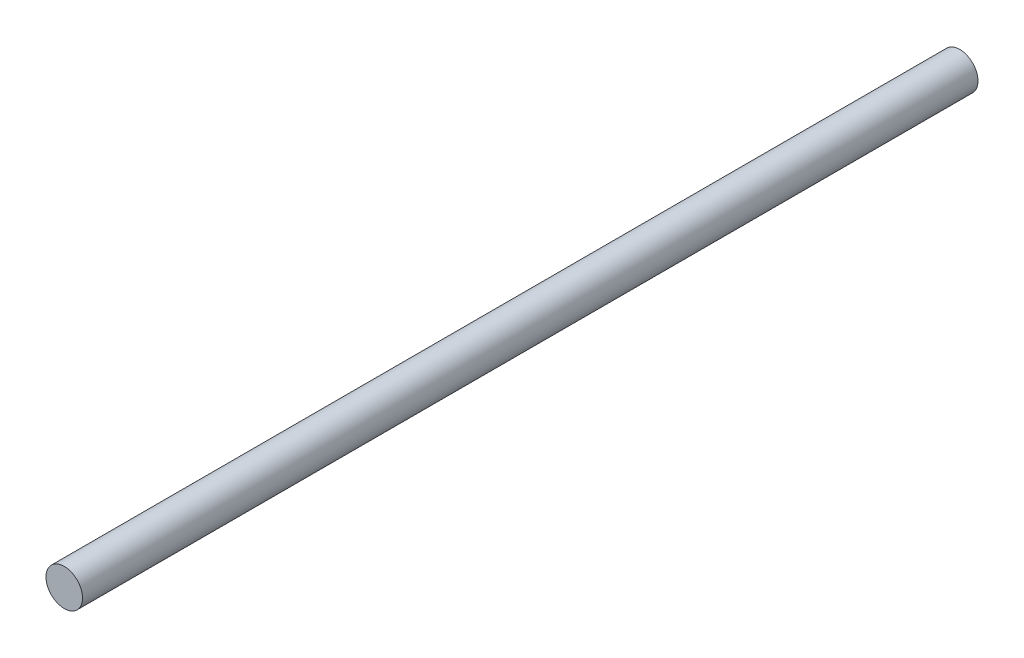
ISO-10303-21;
HEADER;
FILE_DESCRIPTION(('STEP AP214'),'2;1');
FILE_NAME('part.step','',(''),(''),'','','');
FILE_SCHEMA(('AUTOMOTIVE_DESIGN { 1 0 10303 214 1 1 1 1 }'));
ENDSEC;
DATA;
#1=APPLICATION_CONTEXT('core data for automotive mechanical design processes');
#2=APPLICATION_PROTOCOL_DEFINITION('international standard','automotive_design',2000,#1);
#3=PRODUCT_CONTEXT('',#1,'mechanical');
#4=PRODUCT('Part','Part','',(#3));
#5=PRODUCT_RELATED_PRODUCT_CATEGORY('part','',(#4));
#6=PRODUCT_DEFINITION_FORMATION('','',#4);
#7=PRODUCT_DEFINITION_CONTEXT('part definition',#1,'design');
#8=PRODUCT_DEFINITION('design','',#6,#7);
#9=PRODUCT_DEFINITION_SHAPE('','',#8);
#10=(LENGTH_UNIT() NAMED_UNIT(*) SI_UNIT(.MILLI.,.METRE.));
#11=(NAMED_UNIT(*) PLANE_ANGLE_UNIT() SI_UNIT($,.RADIAN.));
#12=(NAMED_UNIT(*) SI_UNIT($,.STERADIAN.) SOLID_ANGLE_UNIT());
#13=UNCERTAINTY_MEASURE_WITH_UNIT(LENGTH_MEASURE(1.E-05),#10,'distance_accuracy_value','');
#14=(GEOMETRIC_REPRESENTATION_CONTEXT(3) GLOBAL_UNCERTAINTY_ASSIGNED_CONTEXT((#13)) GLOBAL_UNIT_ASSIGNED_CONTEXT((#10,
#11,#12)) REPRESENTATION_CONTEXT('',''));
#15=CARTESIAN_POINT('',(0.,0.,0.));
#16=DIRECTION('',(0.,0.,1.));
#17=DIRECTION('',(1.,0.,0.));
#18=AXIS2_PLACEMENT_3D('',#15,#16,#17);
#19=CARTESIAN_POINT('',(0.,0.,49.));
#20=DIRECTION('',(0.,0.,-1.));
#21=DIRECTION('',(-1.,0.,0.));
#22=AXIS2_PLACEMENT_3D('',#19,#20,#21);
#23=CYLINDRICAL_SURFACE('',#22,0.999999999999999);
#24=CARTESIAN_POINT('',(0.,0.,49.));
#25=DIRECTION('',(0.,0.,1.));
#26=DIRECTION('',(1.,0.,0.));
#27=AXIS2_PLACEMENT_3D('',#24,#25,#26);
#28=CIRCLE('',#27,0.999999999999999);
#29=CARTESIAN_POINT('',(0.999999999999999,0.,49.));
#30=VERTEX_POINT('',#29);
#31=EDGE_CURVE('E10',#30,#30,#28,.T.);
#32=ORIENTED_EDGE('',*,*,#31,.F.);
#33=EDGE_LOOP('',(#32));
#34=FACE_BOUND('',#33,.T.);
#35=CARTESIAN_POINT('',(0.,0.,0.));
#36=DIRECTION('',(0.,0.,1.));
#37=DIRECTION('',(1.,0.,0.));
#38=AXIS2_PLACEMENT_3D('',#35,#36,#37);
#39=CIRCLE('',#38,0.999999999999999);
#40=CARTESIAN_POINT('',(0.999999999999999,0.,0.));
#41=VERTEX_POINT('',#40);
#42=EDGE_CURVE('E34',#41,#41,#39,.T.);
#43=ORIENTED_EDGE('',*,*,#42,.T.);
#44=EDGE_LOOP('',(#43));
#45=FACE_BOUND('',#44,.T.);
#46=ADVANCED_FACE('F31',(#34,#45),#23,.T.);
#47=CARTESIAN_POINT('',(0.,0.,49.));
#48=DIRECTION('',(0.,0.,1.));
#49=DIRECTION('',(1.,0.,0.));
#50=AXIS2_PLACEMENT_3D('',#47,#48,#49);
#51=PLANE('',#50);
#52=ORIENTED_EDGE('',*,*,#31,.T.);
#53=EDGE_LOOP('',(#52));
#54=FACE_BOUND('',#53,.T.);
#55=ADVANCED_FACE('F46',(#54),#51,.T.);
#56=CARTESIAN_POINT('',(0.,0.,0.));
#57=DIRECTION('',(0.,0.,1.));
#58=DIRECTION('',(1.,0.,0.));
#59=AXIS2_PLACEMENT_3D('',#56,#57,#58);
#60=PLANE('',#59);
#61=ORIENTED_EDGE('',*,*,#42,.F.);
#62=EDGE_LOOP('',(#61));
#63=FACE_BOUND('',#62,.T.);
#64=ADVANCED_FACE('F44',(#63),#60,.F.);
#65=CLOSED_SHELL('',(#46,#55,#64));
#66=MANIFOLD_SOLID_BREP('B2',#65);
#67=ADVANCED_BREP_SHAPE_REPRESENTATION('',(#18,#66),#14);
#68=SHAPE_DEFINITION_REPRESENTATION(#9,#67);
ENDSEC;
END-ISO-10303-21;
